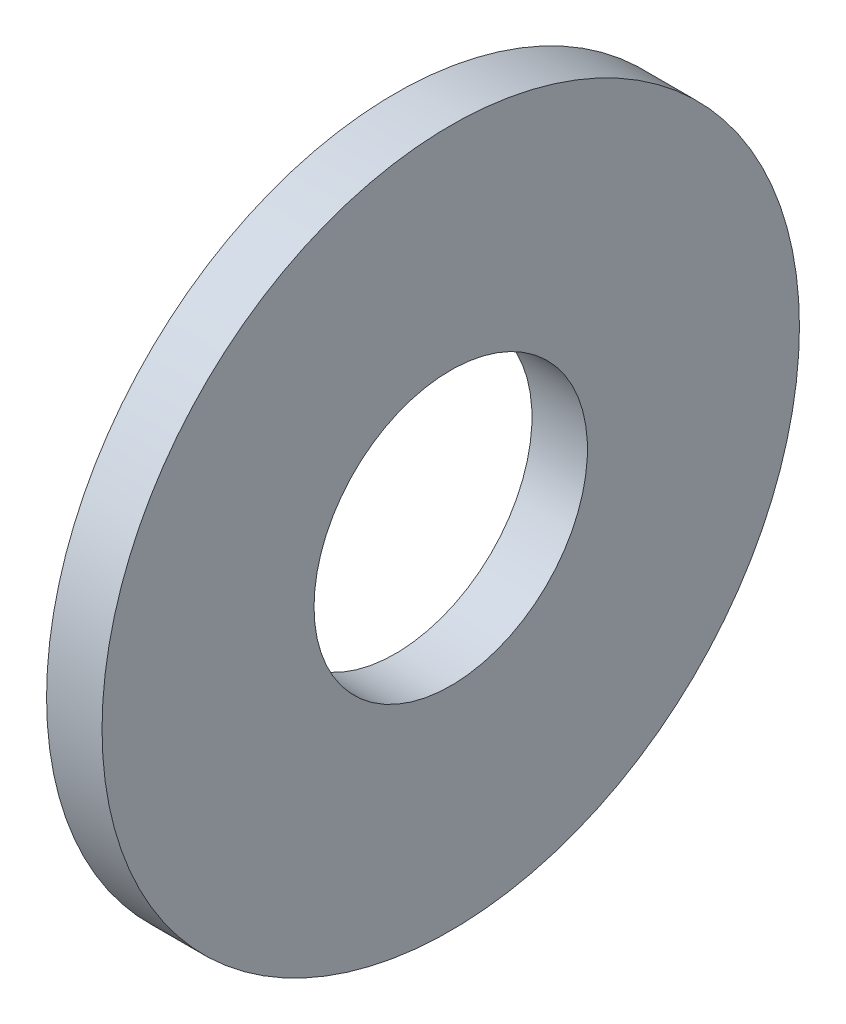
ISO-10303-21;
HEADER;
FILE_DESCRIPTION(('STEP AP214'),'2;1');
FILE_NAME('part.step','',(''),(''),'','','');
FILE_SCHEMA(('AUTOMOTIVE_DESIGN { 1 0 10303 214 1 1 1 1 }'));
ENDSEC;
DATA;
#1=APPLICATION_CONTEXT('core data for automotive mechanical design processes');
#2=APPLICATION_PROTOCOL_DEFINITION('international standard','automotive_design',2000,#1);
#3=PRODUCT_CONTEXT('',#1,'mechanical');
#4=PRODUCT('Part','Part','',(#3));
#5=PRODUCT_RELATED_PRODUCT_CATEGORY('part','',(#4));
#6=PRODUCT_DEFINITION_FORMATION('','',#4);
#7=PRODUCT_DEFINITION_CONTEXT('part definition',#1,'design');
#8=PRODUCT_DEFINITION('design','',#6,#7);
#9=PRODUCT_DEFINITION_SHAPE('','',#8);
#10=(LENGTH_UNIT() NAMED_UNIT(*) SI_UNIT(.MILLI.,.METRE.));
#11=(NAMED_UNIT(*) PLANE_ANGLE_UNIT() SI_UNIT($,.RADIAN.));
#12=(NAMED_UNIT(*) SI_UNIT($,.STERADIAN.) SOLID_ANGLE_UNIT());
#13=UNCERTAINTY_MEASURE_WITH_UNIT(LENGTH_MEASURE(1.E-05),#10,'distance_accuracy_value','');
#14=(GEOMETRIC_REPRESENTATION_CONTEXT(3) GLOBAL_UNCERTAINTY_ASSIGNED_CONTEXT((#13)) GLOBAL_UNIT_ASSIGNED_CONTEXT((#10,
#11,#12)) REPRESENTATION_CONTEXT('',''));
#15=CARTESIAN_POINT('',(0.,0.,0.));
#16=DIRECTION('',(0.,0.,1.));
#17=DIRECTION('',(1.,0.,0.));
#18=AXIS2_PLACEMENT_3D('',#15,#16,#17);
#19=CARTESIAN_POINT('',(-34.9249999999999,0.,0.));
#20=DIRECTION('',(-1.,0.,0.));
#21=DIRECTION('',(0.,0.,1.));
#22=AXIS2_PLACEMENT_3D('',#19,#20,#21);
#23=CYLINDRICAL_SURFACE('',#22,8.625);
#24=CARTESIAN_POINT('',(0.,0.,0.));
#25=DIRECTION('',(-1.,0.,0.));
#26=DIRECTION('',(0.,0.,1.));
#27=AXIS2_PLACEMENT_3D('',#24,#25,#26);
#28=CIRCLE('',#27,8.625);
#29=CARTESIAN_POINT('',(0.,0.,8.625));
#30=VERTEX_POINT('',#29);
#31=EDGE_CURVE('E10',#30,#30,#28,.T.);
#32=ORIENTED_EDGE('',*,*,#31,.F.);
#33=EDGE_LOOP('',(#32));
#34=FACE_BOUND('',#33,.T.);
#35=CARTESIAN_POINT('',(-3.5,0.,0.));
#36=DIRECTION('',(-1.,0.,0.));
#37=DIRECTION('',(0.,0.,1.));
#38=AXIS2_PLACEMENT_3D('',#35,#36,#37);
#39=CIRCLE('',#38,8.625);
#40=CARTESIAN_POINT('',(-3.5,0.,8.625));
#41=VERTEX_POINT('',#40);
#42=EDGE_CURVE('E60',#41,#41,#39,.T.);
#43=ORIENTED_EDGE('',*,*,#42,.T.);
#44=EDGE_LOOP('',(#43));
#45=FACE_BOUND('',#44,.T.);
#46=ADVANCED_FACE('F43',(#34,#45),#23,.F.);
#47=CARTESIAN_POINT('',(0.,8.625,0.));
#48=DIRECTION('',(-1.,0.,0.));
#49=DIRECTION('',(0.,0.,1.));
#50=AXIS2_PLACEMENT_3D('',#47,#48,#49);
#51=PLANE('',#50);
#52=CARTESIAN_POINT('',(0.,0.,0.));
#53=DIRECTION('',(-1.,0.,0.));
#54=DIRECTION('',(0.,0.,1.));
#55=AXIS2_PLACEMENT_3D('',#52,#53,#54);
#56=CIRCLE('',#55,22.);
#57=CARTESIAN_POINT('',(0.,0.,22.));
#58=VERTEX_POINT('',#57);
#59=EDGE_CURVE('E50',#58,#58,#56,.T.);
#60=ORIENTED_EDGE('',*,*,#59,.F.);
#61=EDGE_LOOP('',(#60));
#62=FACE_BOUND('',#61,.T.);
#63=ORIENTED_EDGE('',*,*,#31,.T.);
#64=EDGE_LOOP('',(#63));
#65=FACE_BOUND('',#64,.T.);
#66=ADVANCED_FACE('F76',(#62,#65),#51,.F.);
#67=CARTESIAN_POINT('',(-34.9249999999999,0.,0.));
#68=DIRECTION('',(-1.,0.,0.));
#69=DIRECTION('',(0.,0.,1.));
#70=AXIS2_PLACEMENT_3D('',#67,#68,#69);
#71=CYLINDRICAL_SURFACE('',#70,22.);
#72=CARTESIAN_POINT('',(-3.5,0.,0.));
#73=DIRECTION('',(-1.,0.,0.));
#74=DIRECTION('',(0.,0.,1.));
#75=AXIS2_PLACEMENT_3D('',#72,#73,#74);
#76=CIRCLE('',#75,22.);
#77=CARTESIAN_POINT('',(-3.5,0.,22.));
#78=VERTEX_POINT('',#77);
#79=EDGE_CURVE('E55',#78,#78,#76,.T.);
#80=ORIENTED_EDGE('',*,*,#79,.F.);
#81=EDGE_LOOP('',(#80));
#82=FACE_BOUND('',#81,.T.);
#83=ORIENTED_EDGE('',*,*,#59,.T.);
#84=EDGE_LOOP('',(#83));
#85=FACE_BOUND('',#84,.T.);
#86=ADVANCED_FACE('F71',(#82,#85),#71,.T.);
#87=CARTESIAN_POINT('',(-3.5,22.,0.));
#88=DIRECTION('',(1.,0.,0.));
#89=DIRECTION('',(0.,0.,-1.));
#90=AXIS2_PLACEMENT_3D('',#87,#88,#89);
#91=PLANE('',#90);
#92=ORIENTED_EDGE('',*,*,#42,.F.);
#93=EDGE_LOOP('',(#92));
#94=FACE_BOUND('',#93,.T.);
#95=ORIENTED_EDGE('',*,*,#79,.T.);
#96=EDGE_LOOP('',(#95));
#97=FACE_BOUND('',#96,.T.);
#98=ADVANCED_FACE('F68',(#94,#97),#91,.F.);
#99=CLOSED_SHELL('',(#46,#66,#86,#98));
#100=MANIFOLD_SOLID_BREP('B2',#99);
#101=ADVANCED_BREP_SHAPE_REPRESENTATION('',(#18,#100),#14);
#102=SHAPE_DEFINITION_REPRESENTATION(#9,#101);
ENDSEC;
END-ISO-10303-21;
